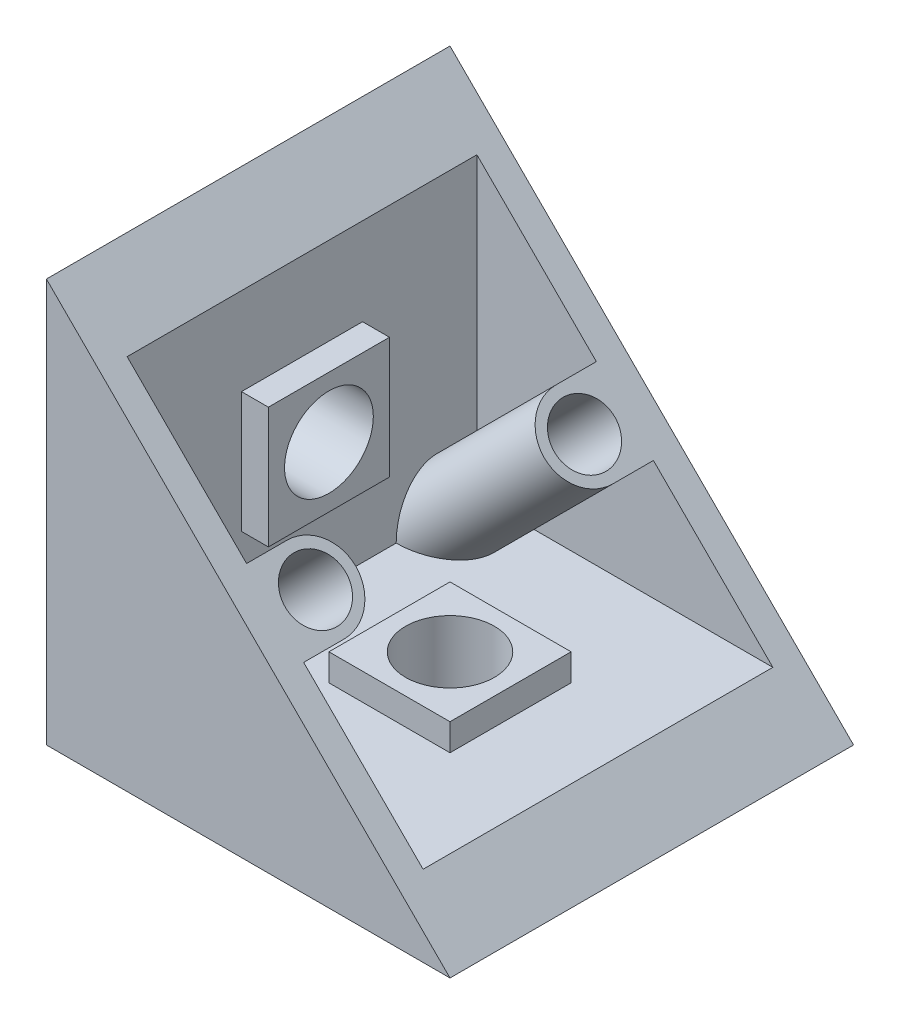
ISO-10303-21;
HEADER;
FILE_DESCRIPTION(('STEP AP214'),'2;1');
FILE_NAME('part.step','',(''),(''),'','','');
FILE_SCHEMA(('AUTOMOTIVE_DESIGN { 1 0 10303 214 1 1 1 1 }'));
ENDSEC;
DATA;
#1=APPLICATION_CONTEXT('core data for automotive mechanical design processes');
#2=APPLICATION_PROTOCOL_DEFINITION('international standard','automotive_design',2000,#1);
#3=PRODUCT_CONTEXT('',#1,'mechanical');
#4=PRODUCT('Part','Part','',(#3));
#5=PRODUCT_RELATED_PRODUCT_CATEGORY('part','',(#4));
#6=PRODUCT_DEFINITION_FORMATION('','',#4);
#7=PRODUCT_DEFINITION_CONTEXT('part definition',#1,'design');
#8=PRODUCT_DEFINITION('design','',#6,#7);
#9=PRODUCT_DEFINITION_SHAPE('','',#8);
#10=(LENGTH_UNIT() NAMED_UNIT(*) SI_UNIT(.MILLI.,.METRE.));
#11=(NAMED_UNIT(*) PLANE_ANGLE_UNIT() SI_UNIT($,.RADIAN.));
#12=(NAMED_UNIT(*) SI_UNIT($,.STERADIAN.) SOLID_ANGLE_UNIT());
#13=UNCERTAINTY_MEASURE_WITH_UNIT(LENGTH_MEASURE(1.E-05),#10,'distance_accuracy_value','');
#14=(GEOMETRIC_REPRESENTATION_CONTEXT(3) GLOBAL_UNCERTAINTY_ASSIGNED_CONTEXT((#13)) GLOBAL_UNIT_ASSIGNED_CONTEXT((#10,
#11,#12)) REPRESENTATION_CONTEXT('',''));
#15=CARTESIAN_POINT('',(0.,0.,0.));
#16=DIRECTION('',(0.,0.,1.));
#17=DIRECTION('',(1.,0.,0.));
#18=AXIS2_PLACEMENT_3D('',#15,#16,#17);
#19=CARTESIAN_POINT('',(4.,0.,-30.));
#20=DIRECTION('',(-1.,0.,0.));
#21=DIRECTION('',(0.,0.,1.));
#22=AXIS2_PLACEMENT_3D('',#19,#20,#21);
#23=PLANE('',#22);
#24=DIRECTION('',(0.,1.,0.));
#25=VECTOR('',#24,1.);
#26=CARTESIAN_POINT('',(4.,19.5,-19.5));
#27=LINE('',#26,#25);
#28=CARTESIAN_POINT('',(4.,10.5,-19.5));
#29=VERTEX_POINT('',#28);
#30=CARTESIAN_POINT('',(4.,19.5,-19.5));
#31=VERTEX_POINT('',#30);
#32=EDGE_CURVE('E271',#29,#31,#27,.T.);
#33=ORIENTED_EDGE('',*,*,#32,.F.);
#34=DIRECTION('',(0.,0.,-1.));
#35=VECTOR('',#34,1.);
#36=CARTESIAN_POINT('',(4.,10.5,-10.5));
#37=LINE('',#36,#35);
#38=CARTESIAN_POINT('',(4.,10.5,-10.5));
#39=VERTEX_POINT('',#38);
#40=EDGE_CURVE('E276',#39,#29,#37,.T.);
#41=ORIENTED_EDGE('',*,*,#40,.F.);
#42=DIRECTION('',(0.,-1.,0.));
#43=VECTOR('',#42,1.);
#44=CARTESIAN_POINT('',(4.,19.5,-10.5));
#45=LINE('',#44,#43);
#46=CARTESIAN_POINT('',(4.,19.5,-10.5));
#47=VERTEX_POINT('',#46);
#48=EDGE_CURVE('E288',#47,#39,#45,.T.);
#49=ORIENTED_EDGE('',*,*,#48,.F.);
#50=DIRECTION('',(0.,0.,1.));
#51=VECTOR('',#50,1.);
#52=CARTESIAN_POINT('',(4.,19.5,-10.5));
#53=LINE('',#52,#51);
#54=EDGE_CURVE('E285',#31,#47,#53,.T.);
#55=ORIENTED_EDGE('',*,*,#54,.F.);
#56=EDGE_LOOP('',(#33,#41,#49,#55));
#57=FACE_BOUND('',#56,.T.);
#58=DIRECTION('',(0.,-1.,0.));
#59=VECTOR('',#58,1.);
#60=CARTESIAN_POINT('',(4.,0.,-2.));
#61=LINE('',#60,#59);
#62=CARTESIAN_POINT('',(4.,26.,-2.));
#63=VERTEX_POINT('',#62);
#64=CARTESIAN_POINT('',(4.,8.24264068711928,-2.));
#65=VERTEX_POINT('',#64);
#66=EDGE_CURVE('E337',#63,#65,#61,.T.);
#67=ORIENTED_EDGE('',*,*,#66,.T.);
#68=DIRECTION('',(0.,0.,-1.));
#69=VECTOR('',#68,1.);
#70=CARTESIAN_POINT('',(4.,8.24264068711933,-30.));
#71=LINE('',#70,#69);
#72=CARTESIAN_POINT('',(4.,8.24264068711929,-5.));
#73=VERTEX_POINT('',#72);
#74=EDGE_CURVE('E236',#65,#73,#71,.T.);
#75=ORIENTED_EDGE('',*,*,#74,.T.);
#76=CARTESIAN_POINT('',(4.,4.,-5.));
#77=DIRECTION('',(-1.,0.,0.));
#78=DIRECTION('',(0.,1.,0.));
#79=AXIS2_PLACEMENT_3D('',#76,#77,#78);
#80=ELLIPSE('',#79,4.24264068711928,3.);
#81=CARTESIAN_POINT('',(4.,4.,-8.));
#82=VERTEX_POINT('',#81);
#83=EDGE_CURVE('E265',#73,#82,#80,.T.);
#84=ORIENTED_EDGE('',*,*,#83,.T.);
#85=DIRECTION('',(0.,0.,1.));
#86=VECTOR('',#85,1.);
#87=CARTESIAN_POINT('',(4.,4.,-30.));
#88=LINE('',#87,#86);
#89=CARTESIAN_POINT('',(4.,4.,-22.));
#90=VERTEX_POINT('',#89);
#91=EDGE_CURVE('E347',#90,#82,#88,.T.);
#92=ORIENTED_EDGE('',*,*,#91,.F.);
#93=CARTESIAN_POINT('',(4.,3.99999999999998,-25.));
#94=DIRECTION('',(-1.,0.,0.));
#95=DIRECTION('',(0.,1.,0.));
#96=AXIS2_PLACEMENT_3D('',#93,#94,#95);
#97=ELLIPSE('',#96,4.24264068711928,3.);
#98=CARTESIAN_POINT('',(4.,8.24264068711926,-25.));
#99=VERTEX_POINT('',#98);
#100=EDGE_CURVE('E58',#99,#90,#97,.F.);
#101=ORIENTED_EDGE('',*,*,#100,.F.);
#102=DIRECTION('',(0.,0.,1.));
#103=VECTOR('',#102,1.);
#104=CARTESIAN_POINT('',(4.,8.24264068711926,-30.));
#105=LINE('',#104,#103);
#106=CARTESIAN_POINT('',(4.,8.24264068711926,-28.));
#107=VERTEX_POINT('',#106);
#108=EDGE_CURVE('E259',#107,#99,#105,.T.);
#109=ORIENTED_EDGE('',*,*,#108,.F.);
#110=DIRECTION('',(0.,-1.,0.));
#111=VECTOR('',#110,1.);
#112=CARTESIAN_POINT('',(4.,0.,-28.));
#113=LINE('',#112,#111);
#114=CARTESIAN_POINT('',(4.,26.,-28.));
#115=VERTEX_POINT('',#114);
#116=EDGE_CURVE('E341',#115,#107,#113,.T.);
#117=ORIENTED_EDGE('',*,*,#116,.F.);
#118=DIRECTION('',(0.,0.,1.));
#119=VECTOR('',#118,1.);
#120=CARTESIAN_POINT('',(4.,26.,-30.));
#121=LINE('',#120,#119);
#122=EDGE_CURVE('E354',#115,#63,#121,.T.);
#123=ORIENTED_EDGE('',*,*,#122,.T.);
#124=EDGE_LOOP('',(#67,#75,#84,#92,#101,#109,#117,#123));
#125=FACE_BOUND('',#124,.T.);
#126=ADVANCED_FACE('F43',(#57,#125),#23,.F.);
#127=CARTESIAN_POINT('',(0.,4.,-30.));
#128=DIRECTION('',(0.,-1.,0.));
#129=DIRECTION('',(0.,0.,-1.));
#130=AXIS2_PLACEMENT_3D('',#127,#128,#129);
#131=PLANE('',#130);
#132=DIRECTION('',(0.,0.,-1.));
#133=VECTOR('',#132,1.);
#134=CARTESIAN_POINT('',(19.5,4.,-19.5));
#135=LINE('',#134,#133);
#136=CARTESIAN_POINT('',(19.5,4.,-10.5));
#137=VERTEX_POINT('',#136);
#138=CARTESIAN_POINT('',(19.5,4.,-19.5));
#139=VERTEX_POINT('',#138);
#140=EDGE_CURVE('E304',#137,#139,#135,.T.);
#141=ORIENTED_EDGE('',*,*,#140,.F.);
#142=DIRECTION('',(1.,0.,0.));
#143=VECTOR('',#142,1.);
#144=CARTESIAN_POINT('',(10.5,4.,-10.5));
#145=LINE('',#144,#143);
#146=CARTESIAN_POINT('',(10.5,4.,-10.5));
#147=VERTEX_POINT('',#146);
#148=EDGE_CURVE('E309',#147,#137,#145,.T.);
#149=ORIENTED_EDGE('',*,*,#148,.F.);
#150=DIRECTION('',(0.,0.,1.));
#151=VECTOR('',#150,1.);
#152=CARTESIAN_POINT('',(10.5,4.,-19.5));
#153=LINE('',#152,#151);
#154=CARTESIAN_POINT('',(10.5,4.,-19.5));
#155=VERTEX_POINT('',#154);
#156=EDGE_CURVE('E321',#155,#147,#153,.T.);
#157=ORIENTED_EDGE('',*,*,#156,.F.);
#158=DIRECTION('',(-1.,0.,0.));
#159=VECTOR('',#158,1.);
#160=CARTESIAN_POINT('',(10.5,4.,-19.5));
#161=LINE('',#160,#159);
#162=EDGE_CURVE('E318',#139,#155,#161,.T.);
#163=ORIENTED_EDGE('',*,*,#162,.F.);
#164=EDGE_LOOP('',(#141,#149,#157,#163));
#165=FACE_BOUND('',#164,.T.);
#166=DIRECTION('',(0.,0.,-1.));
#167=VECTOR('',#166,1.);
#168=CARTESIAN_POINT('',(8.24264068711926,4.,-30.));
#169=LINE('',#168,#167);
#170=CARTESIAN_POINT('',(8.24264068711929,4.,-2.));
#171=VERTEX_POINT('',#170);
#172=CARTESIAN_POINT('',(8.24264068711929,4.,-5.));
#173=VERTEX_POINT('',#172);
#174=EDGE_CURVE('E211',#171,#173,#169,.T.);
#175=ORIENTED_EDGE('',*,*,#174,.F.);
#176=DIRECTION('',(1.,0.,0.));
#177=VECTOR('',#176,1.);
#178=CARTESIAN_POINT('',(0.,4.,-2.));
#179=LINE('',#178,#177);
#180=CARTESIAN_POINT('',(26.,4.,-2.));
#181=VERTEX_POINT('',#180);
#182=EDGE_CURVE('E340',#171,#181,#179,.T.);
#183=ORIENTED_EDGE('',*,*,#182,.T.);
#184=DIRECTION('',(0.,0.,1.));
#185=VECTOR('',#184,1.);
#186=CARTESIAN_POINT('',(26.,4.,-30.));
#187=LINE('',#186,#185);
#188=CARTESIAN_POINT('',(26.,4.,-28.));
#189=VERTEX_POINT('',#188);
#190=EDGE_CURVE('E358',#189,#181,#187,.T.);
#191=ORIENTED_EDGE('',*,*,#190,.F.);
#192=DIRECTION('',(1.,0.,0.));
#193=VECTOR('',#192,1.);
#194=CARTESIAN_POINT('',(0.,4.,-28.));
#195=LINE('',#194,#193);
#196=CARTESIAN_POINT('',(8.24264068711931,4.,-28.));
#197=VERTEX_POINT('',#196);
#198=EDGE_CURVE('E344',#197,#189,#195,.T.);
#199=ORIENTED_EDGE('',*,*,#198,.F.);
#200=DIRECTION('',(0.,0.,1.));
#201=VECTOR('',#200,1.);
#202=CARTESIAN_POINT('',(8.24264068711931,4.,-30.));
#203=LINE('',#202,#201);
#204=CARTESIAN_POINT('',(8.24264068711931,4.,-25.));
#205=VERTEX_POINT('',#204);
#206=EDGE_CURVE('E66',#197,#205,#203,.T.);
#207=ORIENTED_EDGE('',*,*,#206,.T.);
#208=CARTESIAN_POINT('',(4.00000000000002,4.,-25.));
#209=DIRECTION('',(0.,-1.,0.));
#210=DIRECTION('',(1.,0.,0.));
#211=AXIS2_PLACEMENT_3D('',#208,#209,#210);
#212=ELLIPSE('',#211,4.24264068711928,3.);
#213=EDGE_CURVE('E398',#90,#205,#212,.F.);
#214=ORIENTED_EDGE('',*,*,#213,.F.);
#215=ORIENTED_EDGE('',*,*,#91,.T.);
#216=CARTESIAN_POINT('',(4.,4.,-5.));
#217=DIRECTION('',(0.,-1.,0.));
#218=DIRECTION('',(1.,0.,0.));
#219=AXIS2_PLACEMENT_3D('',#216,#217,#218);
#220=ELLIPSE('',#219,4.24264068711928,3.);
#221=EDGE_CURVE('E51',#82,#173,#220,.T.);
#222=ORIENTED_EDGE('',*,*,#221,.T.);
#223=EDGE_LOOP('',(#175,#183,#191,#199,#207,#214,#215,#222));
#224=FACE_BOUND('',#223,.T.);
#225=ADVANCED_FACE('F400',(#165,#224),#131,.F.);
#226=CARTESIAN_POINT('',(0.,0.,-28.));
#227=DIRECTION('',(0.,0.,-1.));
#228=DIRECTION('',(-1.,0.,0.));
#229=AXIS2_PLACEMENT_3D('',#226,#227,#228);
#230=PLANE('',#229);
#231=DIRECTION('',(-0.707106781186548,-0.707106781186547,0.));
#232=VECTOR('',#231,1.);
#233=CARTESIAN_POINT('',(-2.12132034355963,2.12132034355963,-28.));
#234=LINE('',#233,#232);
#235=CARTESIAN_POINT('',(12.8786796564404,17.1213203435596,-28.));
#236=VERTEX_POINT('',#235);
#237=EDGE_CURVE('E392',#236,#107,#234,.T.);
#238=ORIENTED_EDGE('',*,*,#237,.F.);
#239=DIRECTION('',(-0.707106781186548,0.707106781186548,0.));
#240=VECTOR('',#239,1.);
#241=CARTESIAN_POINT('',(0.,30.,-28.));
#242=LINE('',#241,#240);
#243=EDGE_CURVE('E353',#236,#115,#242,.T.);
#244=ORIENTED_EDGE('',*,*,#243,.T.);
#245=ORIENTED_EDGE('',*,*,#116,.T.);
#246=EDGE_LOOP('',(#238,#244,#245));
#247=FACE_BOUND('',#246,.T.);
#248=ADVANCED_FACE('F413',(#247),#230,.F.);
#249=CARTESIAN_POINT('',(0.,0.,-2.));
#250=DIRECTION('',(0.,0.,-1.));
#251=DIRECTION('',(-1.,0.,0.));
#252=AXIS2_PLACEMENT_3D('',#249,#250,#251);
#253=PLANE('',#252);
#254=ORIENTED_EDGE('',*,*,#182,.F.);
#255=DIRECTION('',(0.707106781186548,0.707106781186547,0.));
#256=VECTOR('',#255,1.);
#257=CARTESIAN_POINT('',(2.12132034355965,-2.12132034355965,-2.));
#258=LINE('',#257,#256);
#259=CARTESIAN_POINT('',(17.1213203435597,12.8786796564404,-2.));
#260=VERTEX_POINT('',#259);
#261=EDGE_CURVE('E388',#171,#260,#258,.T.);
#262=ORIENTED_EDGE('',*,*,#261,.T.);
#263=DIRECTION('',(-0.707106781186548,0.707106781186548,0.));
#264=VECTOR('',#263,1.);
#265=CARTESIAN_POINT('',(0.,30.,-2.));
#266=LINE('',#265,#264);
#267=EDGE_CURVE('E226',#181,#260,#266,.T.);
#268=ORIENTED_EDGE('',*,*,#267,.F.);
#269=EDGE_LOOP('',(#254,#262,#268));
#270=FACE_BOUND('',#269,.T.);
#271=ADVANCED_FACE('F431',(#270),#253,.T.);
#272=CARTESIAN_POINT('',(0.,30.,-30.));
#273=DIRECTION('',(0.707106781186547,0.707106781186547,0.));
#274=DIRECTION('',(-0.707106781186548,0.707106781186548,0.));
#275=AXIS2_PLACEMENT_3D('',#272,#273,#274);
#276=PLANE('',#275);
#277=DIRECTION('',(-0.707106781186547,0.707106781186547,0.));
#278=VECTOR('',#277,1.);
#279=CARTESIAN_POINT('',(0.,30.,0.));
#280=LINE('',#279,#278);
#281=CARTESIAN_POINT('',(30.,0.,0.));
#282=VERTEX_POINT('',#281);
#283=CARTESIAN_POINT('',(0.,30.,0.));
#284=VERTEX_POINT('',#283);
#285=EDGE_CURVE('E366',#282,#284,#280,.T.);
#286=ORIENTED_EDGE('',*,*,#285,.F.);
#287=DIRECTION('',(0.,0.,1.));
#288=VECTOR('',#287,1.);
#289=CARTESIAN_POINT('',(30.,0.,-30.));
#290=LINE('',#289,#288);
#291=CARTESIAN_POINT('',(30.,0.,-30.));
#292=VERTEX_POINT('',#291);
#293=EDGE_CURVE('E383',#292,#282,#290,.T.);
#294=ORIENTED_EDGE('',*,*,#293,.F.);
#295=DIRECTION('',(-0.707106781186547,0.707106781186547,0.));
#296=VECTOR('',#295,1.);
#297=CARTESIAN_POINT('',(0.,30.,-30.));
#298=LINE('',#297,#296);
#299=CARTESIAN_POINT('',(0.,30.,-30.));
#300=VERTEX_POINT('',#299);
#301=EDGE_CURVE('E369',#292,#300,#298,.T.);
#302=ORIENTED_EDGE('',*,*,#301,.T.);
#303=DIRECTION('',(0.,0.,1.));
#304=VECTOR('',#303,1.);
#305=CARTESIAN_POINT('',(0.,30.,-30.));
#306=LINE('',#305,#304);
#307=EDGE_CURVE('E380',#300,#284,#306,.T.);
#308=ORIENTED_EDGE('',*,*,#307,.T.);
#309=EDGE_LOOP('',(#286,#294,#302,#308));
#310=FACE_BOUND('',#309,.T.);
#311=ORIENTED_EDGE('',*,*,#190,.T.);
#312=ORIENTED_EDGE('',*,*,#267,.T.);
#313=DIRECTION('',(0.,0.,1.));
#314=VECTOR('',#313,1.);
#315=CARTESIAN_POINT('',(17.1213203435597,12.8786796564404,0.));
#316=LINE('',#315,#314);
#317=CARTESIAN_POINT('',(17.1213203435597,12.8786796564404,-5.));
#318=VERTEX_POINT('',#317);
#319=EDGE_CURVE('E208',#318,#260,#316,.T.);
#320=ORIENTED_EDGE('',*,*,#319,.F.);
#321=CARTESIAN_POINT('',(15.,15.,-5.));
#322=DIRECTION('',(0.707106781186548,0.707106781186547,0.));
#323=DIRECTION('',(-0.707106781186547,0.707106781186548,0.));
#324=AXIS2_PLACEMENT_3D('',#321,#322,#323);
#325=CIRCLE('',#324,3.);
#326=CARTESIAN_POINT('',(12.8786796564404,17.1213203435596,-5.));
#327=VERTEX_POINT('',#326);
#328=EDGE_CURVE('E224',#318,#327,#325,.T.);
#329=ORIENTED_EDGE('',*,*,#328,.T.);
#330=DIRECTION('',(0.,0.,1.));
#331=VECTOR('',#330,1.);
#332=CARTESIAN_POINT('',(12.8786796564404,17.1213203435596,0.));
#333=LINE('',#332,#331);
#334=CARTESIAN_POINT('',(12.8786796564404,17.1213203435596,-2.));
#335=VERTEX_POINT('',#334);
#336=EDGE_CURVE('E216',#327,#335,#333,.T.);
#337=ORIENTED_EDGE('',*,*,#336,.T.);
#338=EDGE_CURVE('E351',#335,#63,#266,.T.);
#339=ORIENTED_EDGE('',*,*,#338,.T.);
#340=ORIENTED_EDGE('',*,*,#122,.F.);
#341=ORIENTED_EDGE('',*,*,#243,.F.);
#342=DIRECTION('',(0.,0.,-1.));
#343=VECTOR('',#342,1.);
#344=CARTESIAN_POINT('',(12.8786796564404,17.1213203435597,0.));
#345=LINE('',#344,#343);
#346=CARTESIAN_POINT('',(12.8786796564404,17.1213203435596,-25.));
#347=VERTEX_POINT('',#346);
#348=EDGE_CURVE('E245',#347,#236,#345,.T.);
#349=ORIENTED_EDGE('',*,*,#348,.F.);
#350=CARTESIAN_POINT('',(15.,15.,-25.));
#351=DIRECTION('',(0.707106781186548,0.707106781186547,0.));
#352=DIRECTION('',(-0.707106781186547,0.707106781186548,0.));
#353=AXIS2_PLACEMENT_3D('',#350,#351,#352);
#354=CIRCLE('',#353,3.);
#355=CARTESIAN_POINT('',(17.1213203435597,12.8786796564404,-25.));
#356=VERTEX_POINT('',#355);
#357=EDGE_CURVE('E238',#356,#347,#354,.F.);
#358=ORIENTED_EDGE('',*,*,#357,.F.);
#359=DIRECTION('',(0.,0.,-1.));
#360=VECTOR('',#359,1.);
#361=CARTESIAN_POINT('',(17.1213203435596,12.8786796564404,0.));
#362=LINE('',#361,#360);
#363=CARTESIAN_POINT('',(17.1213203435597,12.8786796564403,-28.));
#364=VERTEX_POINT('',#363);
#365=EDGE_CURVE('E241',#356,#364,#362,.T.);
#366=ORIENTED_EDGE('',*,*,#365,.T.);
#367=EDGE_CURVE('E348',#189,#364,#242,.T.);
#368=ORIENTED_EDGE('',*,*,#367,.F.);
#369=EDGE_LOOP('',(#311,#312,#320,#329,#337,#339,#340,#341,#349,#358,#366,#368));
#370=FACE_BOUND('',#369,.T.);
#371=CARTESIAN_POINT('',(15.,15.,-5.));
#372=DIRECTION('',(0.707106781186548,0.707106781186547,0.));
#373=DIRECTION('',(-0.707106781186547,0.707106781186548,0.));
#374=AXIS2_PLACEMENT_3D('',#371,#372,#373);
#375=CIRCLE('',#374,2.25);
#376=CARTESIAN_POINT('',(13.4090097423303,16.5909902576697,-5.));
#377=VERTEX_POINT('',#376);
#378=EDGE_CURVE('E227',#377,#377,#375,.T.);
#379=ORIENTED_EDGE('',*,*,#378,.F.);
#380=EDGE_LOOP('',(#379));
#381=FACE_BOUND('',#380,.T.);
#382=CARTESIAN_POINT('',(15.,15.,-25.));
#383=DIRECTION('',(0.707106781186548,0.707106781186547,0.));
#384=DIRECTION('',(-0.707106781186547,0.707106781186548,0.));
#385=AXIS2_PLACEMENT_3D('',#382,#383,#384);
#386=CIRCLE('',#385,2.25);
#387=CARTESIAN_POINT('',(13.4090097423303,16.5909902576697,-25.));
#388=VERTEX_POINT('',#387);
#389=EDGE_CURVE('E248',#388,#388,#386,.F.);
#390=ORIENTED_EDGE('',*,*,#389,.T.);
#391=EDGE_LOOP('',(#390));
#392=FACE_BOUND('',#391,.T.);
#393=ADVANCED_FACE('F222',(#310,#370,#381,#392),#276,.T.);
#394=CARTESIAN_POINT('',(0.,0.,-30.));
#395=DIRECTION('',(-1.,0.,0.));
#396=DIRECTION('',(0.,0.,1.));
#397=AXIS2_PLACEMENT_3D('',#394,#395,#396);
#398=PLANE('',#397);
#399=CARTESIAN_POINT('',(0.,15.,-15.));
#400=DIRECTION('',(1.,0.,0.));
#401=DIRECTION('',(0.,0.,-1.));
#402=AXIS2_PLACEMENT_3D('',#399,#400,#401);
#403=CIRCLE('',#402,3.3);
#404=CARTESIAN_POINT('',(0.,15.,-18.3));
#405=VERTEX_POINT('',#404);
#406=EDGE_CURVE('E707',#405,#405,#403,.T.);
#407=ORIENTED_EDGE('',*,*,#406,.T.);
#408=EDGE_LOOP('',(#407));
#409=FACE_BOUND('',#408,.T.);
#410=DIRECTION('',(0.,-1.,0.));
#411=VECTOR('',#410,1.);
#412=CARTESIAN_POINT('',(0.,0.,0.));
#413=LINE('',#412,#411);
#414=CARTESIAN_POINT('',(0.,0.,0.));
#415=VERTEX_POINT('',#414);
#416=EDGE_CURVE('E357',#284,#415,#413,.T.);
#417=ORIENTED_EDGE('',*,*,#416,.F.);
#418=ORIENTED_EDGE('',*,*,#307,.F.);
#419=DIRECTION('',(0.,-1.,0.));
#420=VECTOR('',#419,1.);
#421=CARTESIAN_POINT('',(0.,0.,-30.));
#422=LINE('',#421,#420);
#423=CARTESIAN_POINT('',(0.,0.,-30.));
#424=VERTEX_POINT('',#423);
#425=EDGE_CURVE('E362',#300,#424,#422,.T.);
#426=ORIENTED_EDGE('',*,*,#425,.T.);
#427=DIRECTION('',(0.,0.,1.));
#428=VECTOR('',#427,1.);
#429=CARTESIAN_POINT('',(0.,0.,-30.));
#430=LINE('',#429,#428);
#431=EDGE_CURVE('E372',#424,#415,#430,.T.);
#432=ORIENTED_EDGE('',*,*,#431,.T.);
#433=EDGE_LOOP('',(#417,#418,#426,#432));
#434=FACE_BOUND('',#433,.T.);
#435=ADVANCED_FACE('F45',(#409,#434),#398,.T.);
#436=CARTESIAN_POINT('',(0.,0.,-30.));
#437=DIRECTION('',(0.,-1.,0.));
#438=DIRECTION('',(0.,0.,-1.));
#439=AXIS2_PLACEMENT_3D('',#436,#437,#438);
#440=PLANE('',#439);
#441=CARTESIAN_POINT('',(15.,0.,-15.));
#442=DIRECTION('',(0.,1.,0.));
#443=DIRECTION('',(0.,0.,1.));
#444=AXIS2_PLACEMENT_3D('',#441,#442,#443);
#445=CIRCLE('',#444,3.3);
#446=CARTESIAN_POINT('',(15.,0.,-11.7));
#447=VERTEX_POINT('',#446);
#448=EDGE_CURVE('E242',#447,#447,#445,.T.);
#449=ORIENTED_EDGE('',*,*,#448,.T.);
#450=EDGE_LOOP('',(#449));
#451=FACE_BOUND('',#450,.T.);
#452=DIRECTION('',(1.,0.,0.));
#453=VECTOR('',#452,1.);
#454=CARTESIAN_POINT('',(0.,0.,0.));
#455=LINE('',#454,#453);
#456=EDGE_CURVE('E375',#415,#282,#455,.T.);
#457=ORIENTED_EDGE('',*,*,#456,.F.);
#458=ORIENTED_EDGE('',*,*,#431,.F.);
#459=DIRECTION('',(1.,0.,0.));
#460=VECTOR('',#459,1.);
#461=CARTESIAN_POINT('',(0.,0.,-30.));
#462=LINE('',#461,#460);
#463=EDGE_CURVE('E365',#424,#292,#462,.T.);
#464=ORIENTED_EDGE('',*,*,#463,.T.);
#465=ORIENTED_EDGE('',*,*,#293,.T.);
#466=EDGE_LOOP('',(#457,#458,#464,#465));
#467=FACE_BOUND('',#466,.T.);
#468=ADVANCED_FACE('F732',(#451,#467),#440,.T.);
#469=CARTESIAN_POINT('',(0.,0.,-30.));
#470=DIRECTION('',(0.,0.,-1.));
#471=DIRECTION('',(-1.,0.,0.));
#472=AXIS2_PLACEMENT_3D('',#469,#470,#471);
#473=PLANE('',#472);
#474=ORIENTED_EDGE('',*,*,#425,.F.);
#475=ORIENTED_EDGE('',*,*,#301,.F.);
#476=ORIENTED_EDGE('',*,*,#463,.F.);
#477=EDGE_LOOP('',(#474,#475,#476));
#478=FACE_BOUND('',#477,.T.);
#479=ADVANCED_FACE('F729',(#478),#473,.T.);
#480=CARTESIAN_POINT('',(0.,0.,0.));
#481=DIRECTION('',(0.,0.,-1.));
#482=DIRECTION('',(-1.,0.,0.));
#483=AXIS2_PLACEMENT_3D('',#480,#481,#482);
#484=PLANE('',#483);
#485=ORIENTED_EDGE('',*,*,#416,.T.);
#486=ORIENTED_EDGE('',*,*,#456,.T.);
#487=ORIENTED_EDGE('',*,*,#285,.T.);
#488=EDGE_LOOP('',(#485,#486,#487));
#489=FACE_BOUND('',#488,.T.);
#490=ADVANCED_FACE('F548',(#489),#484,.F.);
#491=ORIENTED_EDGE('',*,*,#367,.T.);
#492=DIRECTION('',(-0.707106781186548,-0.707106781186547,0.));
#493=VECTOR('',#492,1.);
#494=CARTESIAN_POINT('',(2.12132034355965,-2.12132034355965,-28.));
#495=LINE('',#494,#493);
#496=EDGE_CURVE('E390',#364,#197,#495,.T.);
#497=ORIENTED_EDGE('',*,*,#496,.T.);
#498=ORIENTED_EDGE('',*,*,#198,.T.);
#499=EDGE_LOOP('',(#491,#497,#498));
#500=FACE_BOUND('',#499,.T.);
#501=ADVANCED_FACE('F429',(#500),#230,.F.);
#502=DIRECTION('',(0.707106781186548,0.707106781186547,0.));
#503=VECTOR('',#502,1.);
#504=CARTESIAN_POINT('',(-2.12132034355964,2.12132034355964,-2.));
#505=LINE('',#504,#503);
#506=EDGE_CURVE('E382',#65,#335,#505,.T.);
#507=ORIENTED_EDGE('',*,*,#506,.F.);
#508=ORIENTED_EDGE('',*,*,#66,.F.);
#509=ORIENTED_EDGE('',*,*,#338,.F.);
#510=EDGE_LOOP('',(#507,#508,#509));
#511=FACE_BOUND('',#510,.T.);
#512=ADVANCED_FACE('F408',(#511),#253,.T.);
#513=CARTESIAN_POINT('',(19.5,6.,-19.5));
#514=DIRECTION('',(-1.,0.,0.));
#515=DIRECTION('',(0.,0.,1.));
#516=AXIS2_PLACEMENT_3D('',#513,#514,#515);
#517=PLANE('',#516);
#518=ORIENTED_EDGE('',*,*,#140,.T.);
#519=DIRECTION('',(0.,-1.,0.));
#520=VECTOR('',#519,1.);
#521=CARTESIAN_POINT('',(19.5,6.,-19.5));
#522=LINE('',#521,#520);
#523=CARTESIAN_POINT('',(19.5,6.,-19.5));
#524=VERTEX_POINT('',#523);
#525=EDGE_CURVE('E334',#524,#139,#522,.T.);
#526=ORIENTED_EDGE('',*,*,#525,.F.);
#527=DIRECTION('',(0.,0.,-1.));
#528=VECTOR('',#527,1.);
#529=CARTESIAN_POINT('',(19.5,6.,-19.5));
#530=LINE('',#529,#528);
#531=CARTESIAN_POINT('',(19.5,6.,-10.5));
#532=VERTEX_POINT('',#531);
#533=EDGE_CURVE('E305',#532,#524,#530,.T.);
#534=ORIENTED_EDGE('',*,*,#533,.F.);
#535=DIRECTION('',(0.,-1.,0.));
#536=VECTOR('',#535,1.);
#537=CARTESIAN_POINT('',(19.5,6.,-10.5));
#538=LINE('',#537,#536);
#539=EDGE_CURVE('E315',#532,#137,#538,.T.);
#540=ORIENTED_EDGE('',*,*,#539,.T.);
#541=EDGE_LOOP('',(#518,#526,#534,#540));
#542=FACE_BOUND('',#541,.T.);
#543=ADVANCED_FACE('F443',(#542),#517,.F.);
#544=CARTESIAN_POINT('',(10.5,6.,-19.5));
#545=DIRECTION('',(0.,0.,1.));
#546=DIRECTION('',(1.,0.,0.));
#547=AXIS2_PLACEMENT_3D('',#544,#545,#546);
#548=PLANE('',#547);
#549=ORIENTED_EDGE('',*,*,#162,.T.);
#550=DIRECTION('',(0.,-1.,0.));
#551=VECTOR('',#550,1.);
#552=CARTESIAN_POINT('',(10.5,6.,-19.5));
#553=LINE('',#552,#551);
#554=CARTESIAN_POINT('',(10.5,6.,-19.5));
#555=VERTEX_POINT('',#554);
#556=EDGE_CURVE('E331',#555,#155,#553,.T.);
#557=ORIENTED_EDGE('',*,*,#556,.F.);
#558=DIRECTION('',(-1.,0.,0.));
#559=VECTOR('',#558,1.);
#560=CARTESIAN_POINT('',(10.5,6.,-19.5));
#561=LINE('',#560,#559);
#562=EDGE_CURVE('E308',#524,#555,#561,.T.);
#563=ORIENTED_EDGE('',*,*,#562,.F.);
#564=ORIENTED_EDGE('',*,*,#525,.T.);
#565=EDGE_LOOP('',(#549,#557,#563,#564));
#566=FACE_BOUND('',#565,.T.);
#567=ADVANCED_FACE('F526',(#566),#548,.F.);
#568=CARTESIAN_POINT('',(10.5,6.,-19.5));
#569=DIRECTION('',(1.,0.,0.));
#570=DIRECTION('',(0.,0.,-1.));
#571=AXIS2_PLACEMENT_3D('',#568,#569,#570);
#572=PLANE('',#571);
#573=ORIENTED_EDGE('',*,*,#156,.T.);
#574=DIRECTION('',(0.,-1.,0.));
#575=VECTOR('',#574,1.);
#576=CARTESIAN_POINT('',(10.5,6.,-10.5));
#577=LINE('',#576,#575);
#578=CARTESIAN_POINT('',(10.5,6.,-10.5));
#579=VERTEX_POINT('',#578);
#580=EDGE_CURVE('E328',#579,#147,#577,.T.);
#581=ORIENTED_EDGE('',*,*,#580,.F.);
#582=DIRECTION('',(0.,0.,1.));
#583=VECTOR('',#582,1.);
#584=CARTESIAN_POINT('',(10.5,6.,-19.5));
#585=LINE('',#584,#583);
#586=EDGE_CURVE('E311',#555,#579,#585,.T.);
#587=ORIENTED_EDGE('',*,*,#586,.F.);
#588=ORIENTED_EDGE('',*,*,#556,.T.);
#589=EDGE_LOOP('',(#573,#581,#587,#588));
#590=FACE_BOUND('',#589,.T.);
#591=ADVANCED_FACE('F522',(#590),#572,.F.);
#592=CARTESIAN_POINT('',(10.5,6.,-10.5));
#593=DIRECTION('',(0.,0.,-1.));
#594=DIRECTION('',(-1.,0.,0.));
#595=AXIS2_PLACEMENT_3D('',#592,#593,#594);
#596=PLANE('',#595);
#597=ORIENTED_EDGE('',*,*,#148,.T.);
#598=ORIENTED_EDGE('',*,*,#539,.F.);
#599=DIRECTION('',(1.,0.,0.));
#600=VECTOR('',#599,1.);
#601=CARTESIAN_POINT('',(10.5,6.,-10.5));
#602=LINE('',#601,#600);
#603=EDGE_CURVE('E313',#579,#532,#602,.T.);
#604=ORIENTED_EDGE('',*,*,#603,.F.);
#605=ORIENTED_EDGE('',*,*,#580,.T.);
#606=EDGE_LOOP('',(#597,#598,#604,#605));
#607=FACE_BOUND('',#606,.T.);
#608=ADVANCED_FACE('F518',(#607),#596,.F.);
#609=CARTESIAN_POINT('',(0.,6.,0.));
#610=DIRECTION('',(0.,1.,0.));
#611=DIRECTION('',(0.,0.,1.));
#612=AXIS2_PLACEMENT_3D('',#609,#610,#611);
#613=PLANE('',#612);
#614=CARTESIAN_POINT('',(15.,6.,-15.));
#615=DIRECTION('',(0.,1.,0.));
#616=DIRECTION('',(0.,0.,1.));
#617=AXIS2_PLACEMENT_3D('',#614,#615,#616);
#618=CIRCLE('',#617,3.3);
#619=CARTESIAN_POINT('',(15.,6.,-11.7));
#620=VERTEX_POINT('',#619);
#621=EDGE_CURVE('E712',#620,#620,#618,.T.);
#622=ORIENTED_EDGE('',*,*,#621,.F.);
#623=EDGE_LOOP('',(#622));
#624=FACE_BOUND('',#623,.T.);
#625=ORIENTED_EDGE('',*,*,#533,.T.);
#626=ORIENTED_EDGE('',*,*,#562,.T.);
#627=ORIENTED_EDGE('',*,*,#586,.T.);
#628=ORIENTED_EDGE('',*,*,#603,.T.);
#629=EDGE_LOOP('',(#625,#626,#627,#628));
#630=FACE_BOUND('',#629,.T.);
#631=ADVANCED_FACE('F514',(#624,#630),#613,.T.);
#632=CARTESIAN_POINT('',(6.,19.5,-19.5));
#633=DIRECTION('',(0.,0.,1.));
#634=DIRECTION('',(0.,-1.,0.));
#635=AXIS2_PLACEMENT_3D('',#632,#633,#634);
#636=PLANE('',#635);
#637=ORIENTED_EDGE('',*,*,#32,.T.);
#638=DIRECTION('',(-1.,0.,0.));
#639=VECTOR('',#638,1.);
#640=CARTESIAN_POINT('',(6.,19.5,-19.5));
#641=LINE('',#640,#639);
#642=CARTESIAN_POINT('',(6.,19.5,-19.5));
#643=VERTEX_POINT('',#642);
#644=EDGE_CURVE('E301',#643,#31,#641,.T.);
#645=ORIENTED_EDGE('',*,*,#644,.F.);
#646=DIRECTION('',(0.,1.,0.));
#647=VECTOR('',#646,1.);
#648=CARTESIAN_POINT('',(6.,19.5,-19.5));
#649=LINE('',#648,#647);
#650=CARTESIAN_POINT('',(6.,10.5,-19.5));
#651=VERTEX_POINT('',#650);
#652=EDGE_CURVE('E272',#651,#643,#649,.T.);
#653=ORIENTED_EDGE('',*,*,#652,.F.);
#654=DIRECTION('',(-1.,0.,0.));
#655=VECTOR('',#654,1.);
#656=CARTESIAN_POINT('',(6.,10.5,-19.5));
#657=LINE('',#656,#655);
#658=EDGE_CURVE('E282',#651,#29,#657,.T.);
#659=ORIENTED_EDGE('',*,*,#658,.T.);
#660=EDGE_LOOP('',(#637,#645,#653,#659));
#661=FACE_BOUND('',#660,.T.);
#662=ADVANCED_FACE('F510',(#661),#636,.F.);
#663=CARTESIAN_POINT('',(6.,19.5,-10.5));
#664=DIRECTION('',(0.,-1.,0.));
#665=DIRECTION('',(0.,0.,-1.));
#666=AXIS2_PLACEMENT_3D('',#663,#664,#665);
#667=PLANE('',#666);
#668=ORIENTED_EDGE('',*,*,#54,.T.);
#669=DIRECTION('',(-1.,0.,0.));
#670=VECTOR('',#669,1.);
#671=CARTESIAN_POINT('',(6.,19.5,-10.5));
#672=LINE('',#671,#670);
#673=CARTESIAN_POINT('',(6.,19.5,-10.5));
#674=VERTEX_POINT('',#673);
#675=EDGE_CURVE('E298',#674,#47,#672,.T.);
#676=ORIENTED_EDGE('',*,*,#675,.F.);
#677=DIRECTION('',(0.,0.,1.));
#678=VECTOR('',#677,1.);
#679=CARTESIAN_POINT('',(6.,19.5,-10.5));
#680=LINE('',#679,#678);
#681=EDGE_CURVE('E275',#643,#674,#680,.T.);
#682=ORIENTED_EDGE('',*,*,#681,.F.);
#683=ORIENTED_EDGE('',*,*,#644,.T.);
#684=EDGE_LOOP('',(#668,#676,#682,#683));
#685=FACE_BOUND('',#684,.T.);
#686=ADVANCED_FACE('F506',(#685),#667,.F.);
#687=CARTESIAN_POINT('',(6.,19.5,-10.5));
#688=DIRECTION('',(0.,0.,-1.));
#689=DIRECTION('',(0.,1.,0.));
#690=AXIS2_PLACEMENT_3D('',#687,#688,#689);
#691=PLANE('',#690);
#692=ORIENTED_EDGE('',*,*,#48,.T.);
#693=DIRECTION('',(-1.,0.,0.));
#694=VECTOR('',#693,1.);
#695=CARTESIAN_POINT('',(6.,10.5,-10.5));
#696=LINE('',#695,#694);
#697=CARTESIAN_POINT('',(6.,10.5,-10.5));
#698=VERTEX_POINT('',#697);
#699=EDGE_CURVE('E295',#698,#39,#696,.T.);
#700=ORIENTED_EDGE('',*,*,#699,.F.);
#701=DIRECTION('',(0.,-1.,0.));
#702=VECTOR('',#701,1.);
#703=CARTESIAN_POINT('',(6.,19.5,-10.5));
#704=LINE('',#703,#702);
#705=EDGE_CURVE('E278',#674,#698,#704,.T.);
#706=ORIENTED_EDGE('',*,*,#705,.F.);
#707=ORIENTED_EDGE('',*,*,#675,.T.);
#708=EDGE_LOOP('',(#692,#700,#706,#707));
#709=FACE_BOUND('',#708,.T.);
#710=ADVANCED_FACE('F502',(#709),#691,.F.);
#711=CARTESIAN_POINT('',(6.,10.5,-10.5));
#712=DIRECTION('',(0.,1.,0.));
#713=DIRECTION('',(0.,0.,1.));
#714=AXIS2_PLACEMENT_3D('',#711,#712,#713);
#715=PLANE('',#714);
#716=ORIENTED_EDGE('',*,*,#40,.T.);
#717=ORIENTED_EDGE('',*,*,#658,.F.);
#718=DIRECTION('',(0.,0.,-1.));
#719=VECTOR('',#718,1.);
#720=CARTESIAN_POINT('',(6.,10.5,-10.5));
#721=LINE('',#720,#719);
#722=EDGE_CURVE('E280',#698,#651,#721,.T.);
#723=ORIENTED_EDGE('',*,*,#722,.F.);
#724=ORIENTED_EDGE('',*,*,#699,.T.);
#725=EDGE_LOOP('',(#716,#717,#723,#724));
#726=FACE_BOUND('',#725,.T.);
#727=ADVANCED_FACE('F485',(#726),#715,.F.);
#728=CARTESIAN_POINT('',(6.,0.,0.));
#729=DIRECTION('',(1.,0.,0.));
#730=DIRECTION('',(0.,0.,-1.));
#731=AXIS2_PLACEMENT_3D('',#728,#729,#730);
#732=PLANE('',#731);
#733=CARTESIAN_POINT('',(6.,15.,-15.));
#734=DIRECTION('',(1.,0.,0.));
#735=DIRECTION('',(0.,0.,-1.));
#736=AXIS2_PLACEMENT_3D('',#733,#734,#735);
#737=CIRCLE('',#736,3.29999999999999);
#738=CARTESIAN_POINT('',(6.,15.,-18.3));
#739=VERTEX_POINT('',#738);
#740=EDGE_CURVE('E710',#739,#739,#737,.T.);
#741=ORIENTED_EDGE('',*,*,#740,.F.);
#742=EDGE_LOOP('',(#741));
#743=FACE_BOUND('',#742,.T.);
#744=ORIENTED_EDGE('',*,*,#652,.T.);
#745=ORIENTED_EDGE('',*,*,#681,.T.);
#746=ORIENTED_EDGE('',*,*,#705,.T.);
#747=ORIENTED_EDGE('',*,*,#722,.T.);
#748=EDGE_LOOP('',(#744,#745,#746,#747));
#749=FACE_BOUND('',#748,.T.);
#750=ADVANCED_FACE('F477',(#743,#749),#732,.T.);
#751=CARTESIAN_POINT('',(4.,4.,-5.));
#752=DIRECTION('',(0.707106781186548,0.707106781186548,0.));
#753=DIRECTION('',(-0.707106781186547,0.707106781186548,0.));
#754=AXIS2_PLACEMENT_3D('',#751,#752,#753);
#755=CYLINDRICAL_SURFACE('',#754,2.25);
#756=ORIENTED_EDGE('',*,*,#378,.T.);
#757=EDGE_LOOP('',(#756));
#758=FACE_BOUND('',#757,.T.);
#759=CARTESIAN_POINT('',(4.,4.,-5.));
#760=DIRECTION('',(0.,-1.,0.));
#761=DIRECTION('',(1.,0.,0.));
#762=AXIS2_PLACEMENT_3D('',#759,#760,#761);
#763=ELLIPSE('',#762,3.18198051533946,2.25);
#764=CARTESIAN_POINT('',(4.,4.,-7.25));
#765=VERTEX_POINT('',#764);
#766=CARTESIAN_POINT('',(4.,4.,-2.75));
#767=VERTEX_POINT('',#766);
#768=EDGE_CURVE('E11',#765,#767,#763,.T.);
#769=ORIENTED_EDGE('',*,*,#768,.T.);
#770=CARTESIAN_POINT('',(4.,4.,-5.));
#771=DIRECTION('',(-1.,0.,0.));
#772=DIRECTION('',(0.,1.,0.));
#773=AXIS2_PLACEMENT_3D('',#770,#771,#772);
#774=ELLIPSE('',#773,3.18198051533946,2.25);
#775=EDGE_CURVE('E268',#767,#765,#774,.T.);
#776=ORIENTED_EDGE('',*,*,#775,.T.);
#777=EDGE_LOOP('',(#769,#776));
#778=FACE_BOUND('',#777,.T.);
#779=ADVANCED_FACE('F475',(#758,#778),#755,.F.);
#780=CARTESIAN_POINT('',(4.,4.,-5.));
#781=DIRECTION('',(0.707106781186548,0.707106781186548,0.));
#782=DIRECTION('',(-0.707106781186547,0.707106781186548,0.));
#783=AXIS2_PLACEMENT_3D('',#780,#781,#782);
#784=CYLINDRICAL_SURFACE('',#783,3.);
#785=ORIENTED_EDGE('',*,*,#83,.F.);
#786=DIRECTION('',(0.707106781186548,0.707106781186548,0.));
#787=VECTOR('',#786,1.);
#788=CARTESIAN_POINT('',(1.87867965644036,6.12132034355964,-5.));
#789=LINE('',#788,#787);
#790=EDGE_CURVE('E215',#73,#327,#789,.T.);
#791=ORIENTED_EDGE('',*,*,#790,.T.);
#792=ORIENTED_EDGE('',*,*,#328,.F.);
#793=DIRECTION('',(0.707106781186548,0.707106781186548,0.));
#794=VECTOR('',#793,1.);
#795=CARTESIAN_POINT('',(6.12132034355964,1.87867965644036,-5.));
#796=LINE('',#795,#794);
#797=EDGE_CURVE('E205',#173,#318,#796,.T.);
#798=ORIENTED_EDGE('',*,*,#797,.F.);
#799=ORIENTED_EDGE('',*,*,#221,.F.);
#800=EDGE_LOOP('',(#785,#791,#792,#798,#799));
#801=FACE_BOUND('',#800,.T.);
#802=ADVANCED_FACE('F229',(#801),#784,.T.);
#803=CARTESIAN_POINT('',(6.12132034355965,1.87867965644035,0.));
#804=DIRECTION('',(-0.707106781186548,0.707106781186548,0.));
#805=DIRECTION('',(-0.707106781186548,-0.707106781186547,0.));
#806=AXIS2_PLACEMENT_3D('',#803,#804,#805);
#807=PLANE('',#806);
#808=ORIENTED_EDGE('',*,*,#261,.F.);
#809=ORIENTED_EDGE('',*,*,#174,.T.);
#810=ORIENTED_EDGE('',*,*,#797,.T.);
#811=ORIENTED_EDGE('',*,*,#319,.T.);
#812=EDGE_LOOP('',(#808,#809,#810,#811));
#813=FACE_BOUND('',#812,.T.);
#814=ADVANCED_FACE('F207',(#813),#807,.F.);
#815=CARTESIAN_POINT('',(1.87867965644036,6.12132034355964,0.));
#816=DIRECTION('',(-0.707106781186548,0.707106781186548,0.));
#817=DIRECTION('',(-0.707106781186548,-0.707106781186547,0.));
#818=AXIS2_PLACEMENT_3D('',#815,#816,#817);
#819=PLANE('',#818);
#820=ORIENTED_EDGE('',*,*,#74,.F.);
#821=ORIENTED_EDGE('',*,*,#506,.T.);
#822=ORIENTED_EDGE('',*,*,#336,.F.);
#823=ORIENTED_EDGE('',*,*,#790,.F.);
#824=EDGE_LOOP('',(#820,#821,#822,#823));
#825=FACE_BOUND('',#824,.T.);
#826=ADVANCED_FACE('F405',(#825),#819,.T.);
#827=CARTESIAN_POINT('',(4.00000000000002,3.99999999999999,-25.));
#828=DIRECTION('',(0.707106781186548,0.707106781186548,0.));
#829=DIRECTION('',(-0.707106781186547,0.707106781186548,0.));
#830=AXIS2_PLACEMENT_3D('',#827,#828,#829);
#831=CYLINDRICAL_SURFACE('',#830,3.);
#832=DIRECTION('',(0.707106781186548,0.707106781186548,0.));
#833=VECTOR('',#832,1.);
#834=CARTESIAN_POINT('',(1.87867965644037,6.12132034355963,-25.));
#835=LINE('',#834,#833);
#836=EDGE_CURVE('E252',#99,#347,#835,.T.);
#837=ORIENTED_EDGE('',*,*,#836,.F.);
#838=ORIENTED_EDGE('',*,*,#100,.T.);
#839=ORIENTED_EDGE('',*,*,#213,.T.);
#840=DIRECTION('',(0.707106781186548,0.707106781186548,0.));
#841=VECTOR('',#840,1.);
#842=CARTESIAN_POINT('',(6.12132034355965,1.87867965644035,-25.));
#843=LINE('',#842,#841);
#844=EDGE_CURVE('E251',#205,#356,#843,.T.);
#845=ORIENTED_EDGE('',*,*,#844,.T.);
#846=ORIENTED_EDGE('',*,*,#357,.T.);
#847=EDGE_LOOP('',(#837,#838,#839,#845,#846));
#848=FACE_BOUND('',#847,.T.);
#849=ADVANCED_FACE('F421',(#848),#831,.T.);
#850=CARTESIAN_POINT('',(4.00000000000001,3.99999999999999,-25.));
#851=DIRECTION('',(0.707106781186548,0.707106781186548,0.));
#852=DIRECTION('',(-0.707106781186547,0.707106781186548,0.));
#853=AXIS2_PLACEMENT_3D('',#850,#851,#852);
#854=CYLINDRICAL_SURFACE('',#853,2.25);
#855=ORIENTED_EDGE('',*,*,#389,.F.);
#856=EDGE_LOOP('',(#855));
#857=FACE_BOUND('',#856,.T.);
#858=CARTESIAN_POINT('',(4.,3.99999999999998,-25.));
#859=DIRECTION('',(-1.,0.,0.));
#860=DIRECTION('',(0.,1.,0.));
#861=AXIS2_PLACEMENT_3D('',#858,#859,#860);
#862=ELLIPSE('',#861,3.18198051533946,2.25);
#863=CARTESIAN_POINT('',(4.,4.,-27.25));
#864=VERTEX_POINT('',#863);
#865=CARTESIAN_POINT('',(4.,4.,-22.75));
#866=VERTEX_POINT('',#865);
#867=EDGE_CURVE('E261',#864,#866,#862,.F.);
#868=ORIENTED_EDGE('',*,*,#867,.F.);
#869=CARTESIAN_POINT('',(4.00000000000002,4.,-25.));
#870=DIRECTION('',(0.,-1.,0.));
#871=DIRECTION('',(1.,0.,0.));
#872=AXIS2_PLACEMENT_3D('',#869,#870,#871);
#873=ELLIPSE('',#872,3.18198051533946,2.25);
#874=EDGE_CURVE('E395',#866,#864,#873,.F.);
#875=ORIENTED_EDGE('',*,*,#874,.F.);
#876=EDGE_LOOP('',(#868,#875));
#877=FACE_BOUND('',#876,.T.);
#878=ADVANCED_FACE('F491',(#857,#877),#854,.F.);
#879=CARTESIAN_POINT('',(1.87867965644035,6.12132034355965,0.));
#880=DIRECTION('',(0.707106781186548,-0.707106781186548,0.));
#881=DIRECTION('',(0.707106781186548,0.707106781186547,0.));
#882=AXIS2_PLACEMENT_3D('',#879,#880,#881);
#883=PLANE('',#882);
#884=ORIENTED_EDGE('',*,*,#237,.T.);
#885=ORIENTED_EDGE('',*,*,#108,.T.);
#886=ORIENTED_EDGE('',*,*,#836,.T.);
#887=ORIENTED_EDGE('',*,*,#348,.T.);
#888=EDGE_LOOP('',(#884,#885,#886,#887));
#889=FACE_BOUND('',#888,.T.);
#890=ADVANCED_FACE('F415',(#889),#883,.F.);
#891=CARTESIAN_POINT('',(6.12132034355963,1.87867965644037,0.));
#892=DIRECTION('',(0.707106781186548,-0.707106781186548,0.));
#893=DIRECTION('',(0.707106781186548,0.707106781186547,0.));
#894=AXIS2_PLACEMENT_3D('',#891,#892,#893);
#895=PLANE('',#894);
#896=ORIENTED_EDGE('',*,*,#206,.F.);
#897=ORIENTED_EDGE('',*,*,#496,.F.);
#898=ORIENTED_EDGE('',*,*,#365,.F.);
#899=ORIENTED_EDGE('',*,*,#844,.F.);
#900=EDGE_LOOP('',(#896,#897,#898,#899));
#901=FACE_BOUND('',#900,.T.);
#902=ADVANCED_FACE('F424',(#901),#895,.T.);
#903=EDGE_CURVE('E349',#864,#866,#88,.T.);
#904=ORIENTED_EDGE('',*,*,#903,.T.);
#905=ORIENTED_EDGE('',*,*,#874,.T.);
#906=EDGE_LOOP('',(#904,#905));
#907=FACE_BOUND('',#906,.T.);
#908=ADVANCED_FACE('F455',(#907),#131,.F.);
#909=ORIENTED_EDGE('',*,*,#903,.F.);
#910=ORIENTED_EDGE('',*,*,#867,.T.);
#911=EDGE_LOOP('',(#909,#910));
#912=FACE_BOUND('',#911,.T.);
#913=ADVANCED_FACE('F447',(#912),#23,.F.);
#914=ORIENTED_EDGE('',*,*,#768,.F.);
#915=EDGE_CURVE('E345',#765,#767,#88,.T.);
#916=ORIENTED_EDGE('',*,*,#915,.T.);
#917=EDGE_LOOP('',(#914,#916));
#918=FACE_BOUND('',#917,.T.);
#919=ADVANCED_FACE('F456',(#918),#131,.F.);
#920=ORIENTED_EDGE('',*,*,#775,.F.);
#921=ORIENTED_EDGE('',*,*,#915,.F.);
#922=EDGE_LOOP('',(#920,#921));
#923=FACE_BOUND('',#922,.T.);
#924=ADVANCED_FACE('F448',(#923),#23,.F.);
#925=CARTESIAN_POINT('',(15.,6.,-15.));
#926=DIRECTION('',(0.,1.,0.));
#927=DIRECTION('',(0.,0.,1.));
#928=AXIS2_PLACEMENT_3D('',#925,#926,#927);
#929=CYLINDRICAL_SURFACE('',#928,3.3);
#930=ORIENTED_EDGE('',*,*,#448,.F.);
#931=EDGE_LOOP('',(#930));
#932=FACE_BOUND('',#931,.T.);
#933=ORIENTED_EDGE('',*,*,#621,.T.);
#934=EDGE_LOOP('',(#933));
#935=FACE_BOUND('',#934,.T.);
#936=ADVANCED_FACE('F461',(#932,#935),#929,.F.);
#937=CARTESIAN_POINT('',(6.,15.,-15.));
#938=DIRECTION('',(1.,0.,0.));
#939=DIRECTION('',(0.,0.,-1.));
#940=AXIS2_PLACEMENT_3D('',#937,#938,#939);
#941=CYLINDRICAL_SURFACE('',#940,3.29999999999999);
#942=ORIENTED_EDGE('',*,*,#406,.F.);
#943=EDGE_LOOP('',(#942));
#944=FACE_BOUND('',#943,.T.);
#945=ORIENTED_EDGE('',*,*,#740,.T.);
#946=EDGE_LOOP('',(#945));
#947=FACE_BOUND('',#946,.T.);
#948=ADVANCED_FACE('F468',(#944,#947),#941,.F.);
#949=CLOSED_SHELL('',(#126,#225,#248,#271,#393,#435,#468,#479,#490,#501,#512,#543,#567,#591,
#608,#631,#662,#686,#710,#727,#750,#779,#802,#814,#826,#849,#878,#890,#902,#908,#913,#919,#924,
#936,#948));
#950=MANIFOLD_SOLID_BREP('B2',#949);
#951=ADVANCED_BREP_SHAPE_REPRESENTATION('',(#18,#950),#14);
#952=SHAPE_DEFINITION_REPRESENTATION(#9,#951);
ENDSEC;
END-ISO-10303-21;
